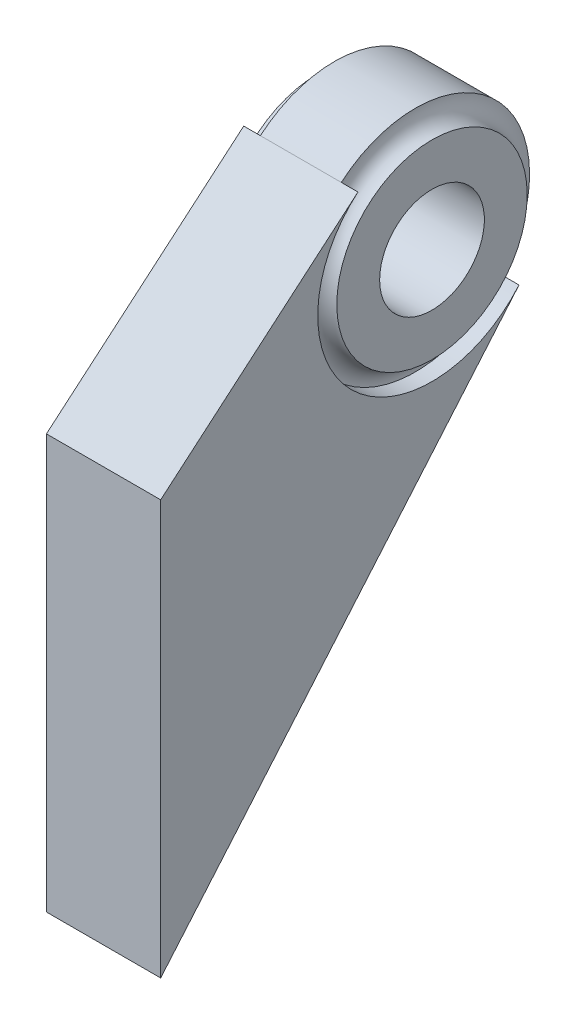
ISO-10303-21;
HEADER;
FILE_DESCRIPTION(('STEP AP214'),'2;1');
FILE_NAME('part.step','',(''),(''),'','','');
FILE_SCHEMA(('AUTOMOTIVE_DESIGN { 1 0 10303 214 1 1 1 1 }'));
ENDSEC;
DATA;
#1=APPLICATION_CONTEXT('core data for automotive mechanical design processes');
#2=APPLICATION_PROTOCOL_DEFINITION('international standard','automotive_design',2000,#1);
#3=PRODUCT_CONTEXT('',#1,'mechanical');
#4=PRODUCT('Part','Part','',(#3));
#5=PRODUCT_RELATED_PRODUCT_CATEGORY('part','',(#4));
#6=PRODUCT_DEFINITION_FORMATION('','',#4);
#7=PRODUCT_DEFINITION_CONTEXT('part definition',#1,'design');
#8=PRODUCT_DEFINITION('design','',#6,#7);
#9=PRODUCT_DEFINITION_SHAPE('','',#8);
#10=(LENGTH_UNIT() NAMED_UNIT(*) SI_UNIT(.MILLI.,.METRE.));
#11=(NAMED_UNIT(*) PLANE_ANGLE_UNIT() SI_UNIT($,.RADIAN.));
#12=(NAMED_UNIT(*) SI_UNIT($,.STERADIAN.) SOLID_ANGLE_UNIT());
#13=UNCERTAINTY_MEASURE_WITH_UNIT(LENGTH_MEASURE(1.E-05),#10,'distance_accuracy_value','');
#14=(GEOMETRIC_REPRESENTATION_CONTEXT(3) GLOBAL_UNCERTAINTY_ASSIGNED_CONTEXT((#13)) GLOBAL_UNIT_ASSIGNED_CONTEXT((#10,
#11,#12)) REPRESENTATION_CONTEXT('',''));
#15=CARTESIAN_POINT('',(0.,0.,0.));
#16=DIRECTION('',(0.,0.,1.));
#17=DIRECTION('',(1.,0.,0.));
#18=AXIS2_PLACEMENT_3D('',#15,#16,#17);
#19=CARTESIAN_POINT('',(-12.,115.,-57.));
#20=DIRECTION('',(1.,0.,0.));
#21=DIRECTION('',(0.,0.,-1.));
#22=AXIS2_PLACEMENT_3D('',#19,#20,#21);
#23=PLANE('',#22);
#24=CARTESIAN_POINT('',(-12.,104.,-57.));
#25=DIRECTION('',(-1.,0.,0.));
#26=DIRECTION('',(0.,0.,1.));
#27=AXIS2_PLACEMENT_3D('',#24,#25,#26);
#28=CIRCLE('',#27,11.);
#29=CARTESIAN_POINT('',(-12.,104.,-46.));
#30=VERTEX_POINT('',#29);
#31=EDGE_CURVE('E11',#30,#30,#28,.T.);
#32=ORIENTED_EDGE('',*,*,#31,.F.);
#33=EDGE_LOOP('',(#32));
#34=FACE_BOUND('',#33,.T.);
#35=CARTESIAN_POINT('',(-12.,104.,-57.));
#36=DIRECTION('',(-1.,0.,0.));
#37=DIRECTION('',(0.,0.,1.));
#38=AXIS2_PLACEMENT_3D('',#35,#36,#37);
#39=CIRCLE('',#38,20.);
#40=CARTESIAN_POINT('',(-12.,104.,-37.));
#41=VERTEX_POINT('',#40);
#42=EDGE_CURVE('E113',#41,#41,#39,.T.);
#43=ORIENTED_EDGE('',*,*,#42,.T.);
#44=EDGE_LOOP('',(#43));
#45=FACE_BOUND('',#44,.T.);
#46=ADVANCED_FACE('F32',(#34,#45),#23,.F.);
#47=CARTESIAN_POINT('',(-36.047482345244,104.,-57.));
#48=DIRECTION('',(-1.,0.,0.));
#49=DIRECTION('',(0.,0.,1.));
#50=AXIS2_PLACEMENT_3D('',#47,#48,#49);
#51=CYLINDRICAL_SURFACE('',#50,11.);
#52=CARTESIAN_POINT('',(12.,104.,-57.));
#53=DIRECTION('',(-1.,0.,0.));
#54=DIRECTION('',(0.,0.,1.));
#55=AXIS2_PLACEMENT_3D('',#52,#53,#54);
#56=CIRCLE('',#55,11.);
#57=CARTESIAN_POINT('',(12.,104.,-46.));
#58=VERTEX_POINT('',#57);
#59=EDGE_CURVE('E39',#58,#58,#56,.T.);
#60=ORIENTED_EDGE('',*,*,#59,.F.);
#61=EDGE_LOOP('',(#60));
#62=FACE_BOUND('',#61,.T.);
#63=ORIENTED_EDGE('',*,*,#31,.T.);
#64=EDGE_LOOP('',(#63));
#65=FACE_BOUND('',#64,.T.);
#66=ADVANCED_FACE('F164',(#62,#65),#51,.F.);
#67=CARTESIAN_POINT('',(12.,115.,-57.));
#68=DIRECTION('',(-1.,0.,0.));
#69=DIRECTION('',(0.,0.,1.));
#70=AXIS2_PLACEMENT_3D('',#67,#68,#69);
#71=PLANE('',#70);
#72=CARTESIAN_POINT('',(12.,104.,-57.));
#73=DIRECTION('',(-1.,0.,0.));
#74=DIRECTION('',(0.,0.,1.));
#75=AXIS2_PLACEMENT_3D('',#72,#73,#74);
#76=CIRCLE('',#75,20.);
#77=CARTESIAN_POINT('',(12.,104.,-37.));
#78=VERTEX_POINT('',#77);
#79=EDGE_CURVE('E154',#78,#78,#76,.T.);
#80=ORIENTED_EDGE('',*,*,#79,.F.);
#81=EDGE_LOOP('',(#80));
#82=FACE_BOUND('',#81,.T.);
#83=ORIENTED_EDGE('',*,*,#59,.T.);
#84=EDGE_LOOP('',(#83));
#85=FACE_BOUND('',#84,.T.);
#86=ADVANCED_FACE('F162',(#82,#85),#71,.F.);
#87=CARTESIAN_POINT('',(12.25,104.,-57.));
#88=DIRECTION('',(-1.,0.,0.));
#89=DIRECTION('',(0.,0.,1.));
#90=AXIS2_PLACEMENT_3D('',#87,#88,#89);
#91=TOROIDAL_SURFACE('',#90,23.75,3.75832409459324);
#92=CARTESIAN_POINT('',(8.50000000000001,104.,-57.));
#93=DIRECTION('',(-1.,0.,0.));
#94=DIRECTION('',(0.,0.,1.));
#95=AXIS2_PLACEMENT_3D('',#92,#93,#94);
#96=CIRCLE('',#95,24.);
#97=CARTESIAN_POINT('',(8.50000000000001,122.27597137308,-41.4440085378535));
#98=VERTEX_POINT('',#97);
#99=CARTESIAN_POINT('',(8.50000000000001,88.4446166334638,-75.2764889494696));
#100=VERTEX_POINT('',#99);
#101=EDGE_CURVE('E153',#98,#100,#96,.T.);
#102=ORIENTED_EDGE('',*,*,#101,.F.);
#103=CARTESIAN_POINT('',(8.50000000000001,104.,-57.));
#104=DIRECTION('',(1.,0.,0.));
#105=DIRECTION('',(0.,0.,-1.));
#106=AXIS2_PLACEMENT_3D('',#103,#104,#105);
#107=CIRCLE('',#106,24.);
#108=EDGE_CURVE('E110',#100,#98,#107,.F.);
#109=ORIENTED_EDGE('',*,*,#108,.F.);
#110=EDGE_LOOP('',(#102,#109));
#111=FACE_BOUND('',#110,.T.);
#112=ORIENTED_EDGE('',*,*,#79,.T.);
#113=EDGE_LOOP('',(#112));
#114=FACE_BOUND('',#113,.T.);
#115=ADVANCED_FACE('F181',(#111,#114),#91,.F.);
#116=CARTESIAN_POINT('',(-36.047482345244,104.,-57.));
#117=DIRECTION('',(-1.,0.,0.));
#118=DIRECTION('',(0.,0.,1.));
#119=AXIS2_PLACEMENT_3D('',#116,#117,#118);
#120=CYLINDRICAL_SURFACE('',#119,24.);
#121=ORIENTED_EDGE('',*,*,#101,.T.);
#122=DIRECTION('',(-1.,0.,0.));
#123=VECTOR('',#122,1.);
#124=CARTESIAN_POINT('',(12.,88.4446166334638,-75.2764889494696));
#125=LINE('',#124,#123);
#126=CARTESIAN_POINT('',(-8.5,88.4446166334638,-75.2764889494696));
#127=VERTEX_POINT('',#126);
#128=EDGE_CURVE('E109',#100,#127,#125,.T.);
#129=ORIENTED_EDGE('',*,*,#128,.T.);
#130=CARTESIAN_POINT('',(-8.5,104.,-57.));
#131=DIRECTION('',(-1.,0.,0.));
#132=DIRECTION('',(0.,0.,1.));
#133=AXIS2_PLACEMENT_3D('',#130,#131,#132);
#134=CIRCLE('',#133,24.);
#135=CARTESIAN_POINT('',(-8.5,122.27597137308,-41.4440085378535));
#136=VERTEX_POINT('',#135);
#137=EDGE_CURVE('E147',#136,#127,#134,.T.);
#138=ORIENTED_EDGE('',*,*,#137,.F.);
#139=DIRECTION('',(-1.,0.,0.));
#140=VECTOR('',#139,1.);
#141=CARTESIAN_POINT('',(12.,122.27597137308,-41.4440085378535));
#142=LINE('',#141,#140);
#143=EDGE_CURVE('E46',#98,#136,#142,.T.);
#144=ORIENTED_EDGE('',*,*,#143,.F.);
#145=EDGE_LOOP('',(#121,#129,#138,#144));
#146=FACE_BOUND('',#145,.T.);
#147=ADVANCED_FACE('F151',(#146),#120,.T.);
#148=CARTESIAN_POINT('',(-12.25,104.,-57.));
#149=DIRECTION('',(-1.,0.,0.));
#150=DIRECTION('',(0.,0.,1.));
#151=AXIS2_PLACEMENT_3D('',#148,#149,#150);
#152=TOROIDAL_SURFACE('',#151,23.75,3.75832409459323);
#153=ORIENTED_EDGE('',*,*,#42,.F.);
#154=EDGE_LOOP('',(#153));
#155=FACE_BOUND('',#154,.T.);
#156=ORIENTED_EDGE('',*,*,#137,.T.);
#157=EDGE_CURVE('E53',#127,#136,#134,.T.);
#158=ORIENTED_EDGE('',*,*,#157,.T.);
#159=EDGE_LOOP('',(#156,#158));
#160=FACE_BOUND('',#159,.T.);
#161=ADVANCED_FACE('F146',(#155,#160),#152,.F.);
#162=CARTESIAN_POINT('',(12.,104.,-57.));
#163=DIRECTION('',(-1.,0.,0.));
#164=DIRECTION('',(0.,0.,1.));
#165=AXIS2_PLACEMENT_3D('',#162,#163,#164);
#166=CYLINDRICAL_SURFACE('',#165,24.);
#167=CARTESIAN_POINT('',(12.,88.4446166334638,-75.2764889494696));
#168=VERTEX_POINT('',#167);
#169=EDGE_CURVE('E89',#168,#100,#125,.T.);
#170=ORIENTED_EDGE('',*,*,#169,.T.);
#171=ORIENTED_EDGE('',*,*,#108,.T.);
#172=CARTESIAN_POINT('',(12.,122.27597137308,-41.4440085378535));
#173=VERTEX_POINT('',#172);
#174=EDGE_CURVE('E91',#173,#98,#142,.T.);
#175=ORIENTED_EDGE('',*,*,#174,.F.);
#176=CARTESIAN_POINT('',(12.,104.,-57.));
#177=DIRECTION('',(-1.,0.,0.));
#178=DIRECTION('',(0.,0.,-1.));
#179=AXIS2_PLACEMENT_3D('',#176,#177,#178);
#180=CIRCLE('',#179,24.);
#181=EDGE_CURVE('E85',#168,#173,#180,.T.);
#182=ORIENTED_EDGE('',*,*,#181,.F.);
#183=EDGE_LOOP('',(#170,#171,#175,#182));
#184=FACE_BOUND('',#183,.T.);
#185=ADVANCED_FACE('F87',(#184),#166,.F.);
#186=CARTESIAN_POINT('',(-12.,122.27597137308,-41.4440085378535));
#187=VERTEX_POINT('',#186);
#188=EDGE_CURVE('E118',#136,#187,#142,.T.);
#189=ORIENTED_EDGE('',*,*,#188,.F.);
#190=ORIENTED_EDGE('',*,*,#157,.F.);
#191=CARTESIAN_POINT('',(-12.,88.4446166334638,-75.2764889494696));
#192=VERTEX_POINT('',#191);
#193=EDGE_CURVE('E112',#127,#192,#125,.T.);
#194=ORIENTED_EDGE('',*,*,#193,.T.);
#195=CARTESIAN_POINT('',(-12.,104.,-57.));
#196=DIRECTION('',(-1.,0.,0.));
#197=DIRECTION('',(0.,0.,-1.));
#198=AXIS2_PLACEMENT_3D('',#195,#196,#197);
#199=CIRCLE('',#198,24.);
#200=EDGE_CURVE('E131',#192,#187,#199,.T.);
#201=ORIENTED_EDGE('',*,*,#200,.T.);
#202=EDGE_LOOP('',(#189,#190,#194,#201));
#203=FACE_BOUND('',#202,.T.);
#204=ADVANCED_FACE('F142',(#203),#166,.F.);
#205=CARTESIAN_POINT('',(12.,0.,0.));
#206=DIRECTION('',(0.,0.648140973605677,0.76152037289457));
#207=DIRECTION('',(0.,-0.76152037289457,0.648140973605677));
#208=AXIS2_PLACEMENT_3D('',#205,#206,#207);
#209=PLANE('',#208);
#210=DIRECTION('',(0.,0.76152037289457,-0.648140973605677));
#211=VECTOR('',#210,1.);
#212=CARTESIAN_POINT('',(-12.,0.,0.));
#213=LINE('',#212,#211);
#214=CARTESIAN_POINT('',(-12.,0.,0.));
#215=VERTEX_POINT('',#214);
#216=EDGE_CURVE('E133',#215,#192,#213,.T.);
#217=ORIENTED_EDGE('',*,*,#216,.T.);
#218=ORIENTED_EDGE('',*,*,#193,.F.);
#219=ORIENTED_EDGE('',*,*,#128,.F.);
#220=ORIENTED_EDGE('',*,*,#169,.F.);
#221=DIRECTION('',(0.,0.76152037289457,-0.648140973605677));
#222=VECTOR('',#221,1.);
#223=CARTESIAN_POINT('',(12.,0.,0.));
#224=LINE('',#223,#222);
#225=CARTESIAN_POINT('',(12.,0.,0.));
#226=VERTEX_POINT('',#225);
#227=EDGE_CURVE('E95',#226,#168,#224,.T.);
#228=ORIENTED_EDGE('',*,*,#227,.F.);
#229=DIRECTION('',(-1.,0.,0.));
#230=VECTOR('',#229,1.);
#231=CARTESIAN_POINT('',(12.,0.,0.));
#232=LINE('',#231,#230);
#233=EDGE_CURVE('E122',#226,#215,#232,.T.);
#234=ORIENTED_EDGE('',*,*,#233,.T.);
#235=EDGE_LOOP('',(#217,#218,#219,#220,#228,#234));
#236=FACE_BOUND('',#235,.T.);
#237=ADVANCED_FACE('F107',(#236),#209,.F.);
#238=CARTESIAN_POINT('',(12.,87.,0.));
#239=DIRECTION('',(0.,-0.761498807211649,-0.648166310922773));
#240=DIRECTION('',(0.,0.648166310922773,-0.761498807211649));
#241=AXIS2_PLACEMENT_3D('',#238,#239,#240);
#242=PLANE('',#241);
#243=DIRECTION('',(0.,-0.648166310922773,0.761498807211649));
#244=VECTOR('',#243,1.);
#245=CARTESIAN_POINT('',(-12.,87.,0.));
#246=LINE('',#245,#244);
#247=CARTESIAN_POINT('',(-12.,87.,0.));
#248=VERTEX_POINT('',#247);
#249=EDGE_CURVE('E129',#187,#248,#246,.T.);
#250=ORIENTED_EDGE('',*,*,#249,.T.);
#251=DIRECTION('',(-1.,0.,0.));
#252=VECTOR('',#251,1.);
#253=CARTESIAN_POINT('',(12.,87.,0.));
#254=LINE('',#253,#252);
#255=CARTESIAN_POINT('',(12.,87.,0.));
#256=VERTEX_POINT('',#255);
#257=EDGE_CURVE('E120',#256,#248,#254,.T.);
#258=ORIENTED_EDGE('',*,*,#257,.F.);
#259=DIRECTION('',(0.,-0.648166310922773,0.761498807211649));
#260=VECTOR('',#259,1.);
#261=CARTESIAN_POINT('',(12.,87.,0.));
#262=LINE('',#261,#260);
#263=EDGE_CURVE('E94',#173,#256,#262,.T.);
#264=ORIENTED_EDGE('',*,*,#263,.F.);
#265=ORIENTED_EDGE('',*,*,#174,.T.);
#266=ORIENTED_EDGE('',*,*,#143,.T.);
#267=ORIENTED_EDGE('',*,*,#188,.T.);
#268=EDGE_LOOP('',(#250,#258,#264,#265,#266,#267));
#269=FACE_BOUND('',#268,.T.);
#270=ADVANCED_FACE('F136',(#269),#242,.F.);
#271=CARTESIAN_POINT('',(12.,0.,0.));
#272=DIRECTION('',(0.,0.,-1.));
#273=DIRECTION('',(-1.,0.,0.));
#274=AXIS2_PLACEMENT_3D('',#271,#272,#273);
#275=PLANE('',#274);
#276=DIRECTION('',(0.,-1.,0.));
#277=VECTOR('',#276,1.);
#278=CARTESIAN_POINT('',(-12.,0.,0.));
#279=LINE('',#278,#277);
#280=EDGE_CURVE('E104',#248,#215,#279,.T.);
#281=ORIENTED_EDGE('',*,*,#280,.T.);
#282=ORIENTED_EDGE('',*,*,#233,.F.);
#283=DIRECTION('',(0.,-1.,0.));
#284=VECTOR('',#283,1.);
#285=CARTESIAN_POINT('',(12.,0.,0.));
#286=LINE('',#285,#284);
#287=EDGE_CURVE('E100',#256,#226,#286,.T.);
#288=ORIENTED_EDGE('',*,*,#287,.F.);
#289=ORIENTED_EDGE('',*,*,#257,.T.);
#290=EDGE_LOOP('',(#281,#282,#288,#289));
#291=FACE_BOUND('',#290,.T.);
#292=ADVANCED_FACE('F138',(#291),#275,.F.);
#293=CARTESIAN_POINT('',(12.,104.,-57.));
#294=DIRECTION('',(1.,0.,0.));
#295=DIRECTION('',(0.,0.,-1.));
#296=AXIS2_PLACEMENT_3D('',#293,#294,#295);
#297=PLANE('',#296);
#298=ORIENTED_EDGE('',*,*,#227,.T.);
#299=ORIENTED_EDGE('',*,*,#181,.T.);
#300=ORIENTED_EDGE('',*,*,#263,.T.);
#301=ORIENTED_EDGE('',*,*,#287,.T.);
#302=EDGE_LOOP('',(#298,#299,#300,#301));
#303=FACE_BOUND('',#302,.T.);
#304=ADVANCED_FACE('F98',(#303),#297,.T.);
#305=CARTESIAN_POINT('',(-12.,104.,-57.));
#306=DIRECTION('',(1.,0.,0.));
#307=DIRECTION('',(0.,0.,-1.));
#308=AXIS2_PLACEMENT_3D('',#305,#306,#307);
#309=PLANE('',#308);
#310=ORIENTED_EDGE('',*,*,#216,.F.);
#311=ORIENTED_EDGE('',*,*,#280,.F.);
#312=ORIENTED_EDGE('',*,*,#249,.F.);
#313=ORIENTED_EDGE('',*,*,#200,.F.);
#314=EDGE_LOOP('',(#310,#311,#312,#313));
#315=FACE_BOUND('',#314,.T.);
#316=ADVANCED_FACE('F141',(#315),#309,.F.);
#317=CLOSED_SHELL('',(#46,#66,#86,#115,#147,#161,#185,#204,#237,#270,#292,#304,#316));
#318=MANIFOLD_SOLID_BREP('B2',#317);
#319=ADVANCED_BREP_SHAPE_REPRESENTATION('',(#18,#318),#14);
#320=SHAPE_DEFINITION_REPRESENTATION(#9,#319);
ENDSEC;
END-ISO-10303-21;
